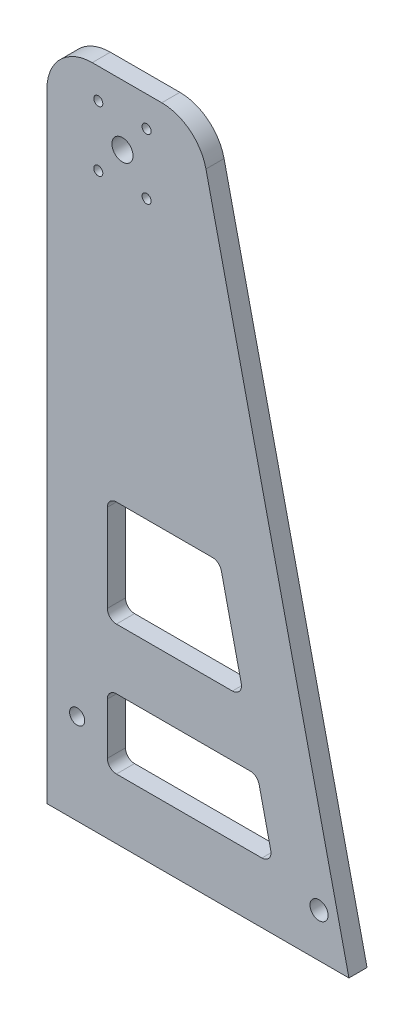
ISO-10303-21;
HEADER;
FILE_DESCRIPTION(('STEP AP214'),'2;1');
FILE_NAME('part.step','',(''),(''),'','','');
FILE_SCHEMA(('AUTOMOTIVE_DESIGN { 1 0 10303 214 1 1 1 1 }'));
ENDSEC;
DATA;
#1=APPLICATION_CONTEXT('core data for automotive mechanical design processes');
#2=APPLICATION_PROTOCOL_DEFINITION('international standard','automotive_design',2000,#1);
#3=PRODUCT_CONTEXT('',#1,'mechanical');
#4=PRODUCT('Part','Part','',(#3));
#5=PRODUCT_RELATED_PRODUCT_CATEGORY('part','',(#4));
#6=PRODUCT_DEFINITION_FORMATION('','',#4);
#7=PRODUCT_DEFINITION_CONTEXT('part definition',#1,'design');
#8=PRODUCT_DEFINITION('design','',#6,#7);
#9=PRODUCT_DEFINITION_SHAPE('','',#8);
#10=(LENGTH_UNIT() NAMED_UNIT(*) SI_UNIT(.MILLI.,.METRE.));
#11=(NAMED_UNIT(*) PLANE_ANGLE_UNIT() SI_UNIT($,.RADIAN.));
#12=(NAMED_UNIT(*) SI_UNIT($,.STERADIAN.) SOLID_ANGLE_UNIT());
#13=UNCERTAINTY_MEASURE_WITH_UNIT(LENGTH_MEASURE(1.E-05),#10,'distance_accuracy_value','');
#14=(GEOMETRIC_REPRESENTATION_CONTEXT(3) GLOBAL_UNCERTAINTY_ASSIGNED_CONTEXT((#13)) GLOBAL_UNIT_ASSIGNED_CONTEXT((#10,
#11,#12)) REPRESENTATION_CONTEXT('',''));
#15=CARTESIAN_POINT('',(0.,0.,0.));
#16=DIRECTION('',(0.,0.,1.));
#17=DIRECTION('',(1.,0.,0.));
#18=AXIS2_PLACEMENT_3D('',#15,#16,#17);
#19=CARTESIAN_POINT('',(0.,0.,6.));
#20=DIRECTION('',(0.,0.,-1.));
#21=DIRECTION('',(-1.,0.,0.));
#22=AXIS2_PLACEMENT_3D('',#19,#20,#21);
#23=PLANE('',#22);
#24=CARTESIAN_POINT('',(90.096252794793,14.5,6.));
#25=DIRECTION('',(0.,0.,-1.));
#26=DIRECTION('',(-1.,0.,0.));
#27=AXIS2_PLACEMENT_3D('',#24,#25,#26);
#28=CIRCLE('',#27,2.99999999999989);
#29=CARTESIAN_POINT('',(87.0962527947931,14.5,6.));
#30=VERTEX_POINT('',#29);
#31=EDGE_CURVE('E225',#30,#30,#28,.T.);
#32=ORIENTED_EDGE('',*,*,#31,.T.);
#33=EDGE_LOOP('',(#32));
#34=FACE_BOUND('',#33,.T.);
#35=CARTESIAN_POINT('',(67.3225612753086,40.,6.));
#36=DIRECTION('',(0.,0.,1.));
#37=DIRECTION('',(1.,0.,0.));
#38=AXIS2_PLACEMENT_3D('',#35,#36,#37);
#39=CIRCLE('',#38,3.);
#40=CARTESIAN_POINT('',(70.247959842683,40.6648633107669,6.));
#41=VERTEX_POINT('',#40);
#42=CARTESIAN_POINT('',(67.3225612753086,43.,6.));
#43=VERTEX_POINT('',#42);
#44=EDGE_CURVE('E256',#41,#43,#39,.T.);
#45=ORIENTED_EDGE('',*,*,#44,.F.);
#46=DIRECTION('',(-0.221621103588969,0.97513285579146,0.));
#47=VECTOR('',#46,1.);
#48=CARTESIAN_POINT('',(74.1115962063194,23.6648633107669,6.));
#49=LINE('',#48,#47);
#50=CARTESIAN_POINT('',(74.1115962063194,23.6648633107669,6.));
#51=VERTEX_POINT('',#50);
#52=EDGE_CURVE('E272',#51,#41,#49,.T.);
#53=ORIENTED_EDGE('',*,*,#52,.F.);
#54=CARTESIAN_POINT('',(71.186197638945,23.,6.));
#55=DIRECTION('',(0.,0.,1.));
#56=DIRECTION('',(1.,0.,0.));
#57=AXIS2_PLACEMENT_3D('',#54,#55,#56);
#58=CIRCLE('',#57,3.);
#59=CARTESIAN_POINT('',(71.186197638945,20.,6.));
#60=VERTEX_POINT('',#59);
#61=EDGE_CURVE('E269',#60,#51,#58,.T.);
#62=ORIENTED_EDGE('',*,*,#61,.F.);
#63=DIRECTION('',(1.,0.,0.));
#64=VECTOR('',#63,1.);
#65=CARTESIAN_POINT('',(23.,20.,6.));
#66=LINE('',#65,#64);
#67=CARTESIAN_POINT('',(23.,20.,6.));
#68=VERTEX_POINT('',#67);
#69=EDGE_CURVE('E267',#68,#60,#66,.T.);
#70=ORIENTED_EDGE('',*,*,#69,.F.);
#71=CARTESIAN_POINT('',(23.,23.,6.));
#72=DIRECTION('',(0.,0.,1.));
#73=DIRECTION('',(1.,0.,0.));
#74=AXIS2_PLACEMENT_3D('',#71,#72,#73);
#75=CIRCLE('',#74,3.);
#76=CARTESIAN_POINT('',(20.,23.,6.));
#77=VERTEX_POINT('',#76);
#78=EDGE_CURVE('E265',#77,#68,#75,.T.);
#79=ORIENTED_EDGE('',*,*,#78,.F.);
#80=DIRECTION('',(0.,-1.,0.));
#81=VECTOR('',#80,1.);
#82=CARTESIAN_POINT('',(20.,40.,6.));
#83=LINE('',#82,#81);
#84=CARTESIAN_POINT('',(20.,40.,6.));
#85=VERTEX_POINT('',#84);
#86=EDGE_CURVE('E263',#85,#77,#83,.T.);
#87=ORIENTED_EDGE('',*,*,#86,.F.);
#88=CARTESIAN_POINT('',(23.,40.,6.));
#89=DIRECTION('',(0.,0.,1.));
#90=DIRECTION('',(-1.,0.,0.));
#91=AXIS2_PLACEMENT_3D('',#88,#89,#90);
#92=CIRCLE('',#91,3.);
#93=CARTESIAN_POINT('',(23.,43.,6.));
#94=VERTEX_POINT('',#93);
#95=EDGE_CURVE('E261',#94,#85,#92,.T.);
#96=ORIENTED_EDGE('',*,*,#95,.F.);
#97=DIRECTION('',(-1.,0.,0.));
#98=VECTOR('',#97,1.);
#99=CARTESIAN_POINT('',(23.,43.,6.));
#100=LINE('',#99,#98);
#101=EDGE_CURVE('E258',#43,#94,#100,.T.);
#102=ORIENTED_EDGE('',*,*,#101,.F.);
#103=EDGE_LOOP('',(#45,#53,#62,#70,#79,#87,#96,#102));
#104=FACE_BOUND('',#103,.T.);
#105=DIRECTION('',(-1.,0.,0.));
#106=VECTOR('',#105,1.);
#107=CARTESIAN_POINT('',(0.,220.,6.));
#108=LINE('',#107,#106);
#109=CARTESIAN_POINT('',(38.0265715827112,220.,6.));
#110=VERTEX_POINT('',#109);
#111=CARTESIAN_POINT('',(15.,220.,6.));
#112=VERTEX_POINT('',#111);
#113=EDGE_CURVE('E357',#110,#112,#108,.T.);
#114=ORIENTED_EDGE('',*,*,#113,.T.);
#115=CARTESIAN_POINT('',(15.,205.,6.));
#116=DIRECTION('',(0.,0.,-1.));
#117=DIRECTION('',(-1.,0.,0.));
#118=AXIS2_PLACEMENT_3D('',#115,#116,#117);
#119=CIRCLE('',#118,15.);
#120=CARTESIAN_POINT('',(0.,205.,6.));
#121=VERTEX_POINT('',#120);
#122=EDGE_CURVE('E41',#112,#121,#119,.F.);
#123=ORIENTED_EDGE('',*,*,#122,.T.);
#124=DIRECTION('',(0.,-1.,0.));
#125=VECTOR('',#124,1.);
#126=CARTESIAN_POINT('',(0.,0.,6.));
#127=LINE('',#126,#125);
#128=CARTESIAN_POINT('',(0.,0.,6.));
#129=VERTEX_POINT('',#128);
#130=EDGE_CURVE('E359',#121,#129,#127,.T.);
#131=ORIENTED_EDGE('',*,*,#130,.T.);
#132=DIRECTION('',(1.,0.,0.));
#133=VECTOR('',#132,1.);
#134=CARTESIAN_POINT('',(100.,0.,6.));
#135=LINE('',#134,#133);
#136=CARTESIAN_POINT('',(100.,0.,6.));
#137=VERTEX_POINT('',#136);
#138=EDGE_CURVE('E351',#129,#137,#135,.T.);
#139=ORIENTED_EDGE('',*,*,#138,.T.);
#140=DIRECTION('',(-0.221621103588968,0.97513285579146,0.));
#141=VECTOR('',#140,1.);
#142=CARTESIAN_POINT('',(50.,220.,6.));
#143=LINE('',#142,#141);
#144=CARTESIAN_POINT('',(52.6535644195831,208.324316553835,6.));
#145=VERTEX_POINT('',#144);
#146=EDGE_CURVE('E354',#137,#145,#143,.T.);
#147=ORIENTED_EDGE('',*,*,#146,.T.);
#148=CARTESIAN_POINT('',(38.0265715827112,205.,6.));
#149=DIRECTION('',(0.,0.,-1.));
#150=DIRECTION('',(-1.,0.,0.));
#151=AXIS2_PLACEMENT_3D('',#148,#149,#150);
#152=CIRCLE('',#151,15.);
#153=EDGE_CURVE('E385',#145,#110,#152,.F.);
#154=ORIENTED_EDGE('',*,*,#153,.T.);
#155=EDGE_LOOP('',(#114,#123,#131,#139,#147,#154));
#156=FACE_BOUND('',#155,.T.);
#157=CARTESIAN_POINT('',(17.,210.,6.));
#158=DIRECTION('',(0.,0.,1.));
#159=DIRECTION('',(1.,0.,0.));
#160=AXIS2_PLACEMENT_3D('',#157,#158,#159);
#161=CIRCLE('',#160,1.5);
#162=CARTESIAN_POINT('',(18.5,210.,6.));
#163=VERTEX_POINT('',#162);
#164=EDGE_CURVE('E345',#163,#163,#161,.T.);
#165=ORIENTED_EDGE('',*,*,#164,.F.);
#166=EDGE_LOOP('',(#165));
#167=FACE_BOUND('',#166,.T.);
#168=CARTESIAN_POINT('',(33.,190.,6.));
#169=DIRECTION('',(0.,0.,1.));
#170=DIRECTION('',(1.,0.,0.));
#171=AXIS2_PLACEMENT_3D('',#168,#169,#170);
#172=CIRCLE('',#171,1.50000000000002);
#173=CARTESIAN_POINT('',(34.5,190.,6.));
#174=VERTEX_POINT('',#173);
#175=EDGE_CURVE('E339',#174,#174,#172,.T.);
#176=ORIENTED_EDGE('',*,*,#175,.F.);
#177=EDGE_LOOP('',(#176));
#178=FACE_BOUND('',#177,.T.);
#179=CARTESIAN_POINT('',(33.,210.,6.));
#180=DIRECTION('',(0.,0.,1.));
#181=DIRECTION('',(-1.,0.,0.));
#182=AXIS2_PLACEMENT_3D('',#179,#180,#181);
#183=CIRCLE('',#182,1.50000000000002);
#184=CARTESIAN_POINT('',(31.5,210.,6.));
#185=VERTEX_POINT('',#184);
#186=EDGE_CURVE('E333',#185,#185,#183,.T.);
#187=ORIENTED_EDGE('',*,*,#186,.F.);
#188=EDGE_LOOP('',(#187));
#189=FACE_BOUND('',#188,.T.);
#190=CARTESIAN_POINT('',(17.,190.,6.));
#191=DIRECTION('',(0.,0.,1.));
#192=DIRECTION('',(-1.,0.,0.));
#193=AXIS2_PLACEMENT_3D('',#190,#191,#192);
#194=CIRCLE('',#193,1.49999999999999);
#195=CARTESIAN_POINT('',(15.5,190.,6.));
#196=VERTEX_POINT('',#195);
#197=EDGE_CURVE('E327',#196,#196,#194,.T.);
#198=ORIENTED_EDGE('',*,*,#197,.F.);
#199=EDGE_LOOP('',(#198));
#200=FACE_BOUND('',#199,.T.);
#201=CARTESIAN_POINT('',(25.,200.,6.));
#202=DIRECTION('',(0.,0.,1.));
#203=DIRECTION('',(1.,0.,0.));
#204=AXIS2_PLACEMENT_3D('',#201,#202,#203);
#205=CIRCLE('',#204,3.5);
#206=CARTESIAN_POINT('',(28.5,200.,6.));
#207=VERTEX_POINT('',#206);
#208=EDGE_CURVE('E321',#207,#207,#205,.T.);
#209=ORIENTED_EDGE('',*,*,#208,.F.);
#210=EDGE_LOOP('',(#209));
#211=FACE_BOUND('',#210,.T.);
#212=CARTESIAN_POINT('',(10.,30.,6.));
#213=DIRECTION('',(0.,0.,1.));
#214=DIRECTION('',(1.,0.,0.));
#215=AXIS2_PLACEMENT_3D('',#212,#213,#214);
#216=CIRCLE('',#215,2.5);
#217=CARTESIAN_POINT('',(12.5,30.,6.));
#218=VERTEX_POINT('',#217);
#219=EDGE_CURVE('E315',#218,#218,#216,.T.);
#220=ORIENTED_EDGE('',*,*,#219,.F.);
#221=EDGE_LOOP('',(#220));
#222=FACE_BOUND('',#221,.T.);
#223=CARTESIAN_POINT('',(54.8225612753087,95.,6.));
#224=DIRECTION('',(0.,0.,1.));
#225=DIRECTION('',(1.,0.,0.));
#226=AXIS2_PLACEMENT_3D('',#223,#224,#225);
#227=CIRCLE('',#226,3.00000000000001);
#228=CARTESIAN_POINT('',(57.747959842683,95.6648633107669,6.));
#229=VERTEX_POINT('',#228);
#230=CARTESIAN_POINT('',(54.8225612753087,98.,6.));
#231=VERTEX_POINT('',#230);
#232=EDGE_CURVE('E184',#229,#231,#227,.T.);
#233=ORIENTED_EDGE('',*,*,#232,.F.);
#234=DIRECTION('',(-0.221621103588968,0.97513285579146,0.));
#235=VECTOR('',#234,1.);
#236=CARTESIAN_POINT('',(64.3388689335921,66.6648633107669,6.));
#237=LINE('',#236,#235);
#238=CARTESIAN_POINT('',(64.3388689335921,66.6648633107669,6.));
#239=VERTEX_POINT('',#238);
#240=EDGE_CURVE('E221',#239,#229,#237,.T.);
#241=ORIENTED_EDGE('',*,*,#240,.F.);
#242=CARTESIAN_POINT('',(61.4134703662177,66.,6.));
#243=DIRECTION('',(0.,0.,1.));
#244=DIRECTION('',(1.,0.,0.));
#245=AXIS2_PLACEMENT_3D('',#242,#243,#244);
#246=CIRCLE('',#245,3.);
#247=CARTESIAN_POINT('',(61.4134703662177,63.,6.));
#248=VERTEX_POINT('',#247);
#249=EDGE_CURVE('E218',#248,#239,#246,.T.);
#250=ORIENTED_EDGE('',*,*,#249,.F.);
#251=DIRECTION('',(1.,0.,0.));
#252=VECTOR('',#251,1.);
#253=CARTESIAN_POINT('',(23.,63.,6.));
#254=LINE('',#253,#252);
#255=CARTESIAN_POINT('',(23.,63.,6.));
#256=VERTEX_POINT('',#255);
#257=EDGE_CURVE('E216',#256,#248,#254,.T.);
#258=ORIENTED_EDGE('',*,*,#257,.F.);
#259=CARTESIAN_POINT('',(23.,66.,6.));
#260=DIRECTION('',(0.,0.,1.));
#261=DIRECTION('',(1.,0.,0.));
#262=AXIS2_PLACEMENT_3D('',#259,#260,#261);
#263=CIRCLE('',#262,3.00000000000001);
#264=CARTESIAN_POINT('',(20.,66.,6.));
#265=VERTEX_POINT('',#264);
#266=EDGE_CURVE('E214',#265,#256,#263,.T.);
#267=ORIENTED_EDGE('',*,*,#266,.F.);
#268=DIRECTION('',(0.,-1.,0.));
#269=VECTOR('',#268,1.);
#270=CARTESIAN_POINT('',(20.,95.,6.));
#271=LINE('',#270,#269);
#272=CARTESIAN_POINT('',(20.,95.,6.));
#273=VERTEX_POINT('',#272);
#274=EDGE_CURVE('E209',#273,#265,#271,.T.);
#275=ORIENTED_EDGE('',*,*,#274,.F.);
#276=CARTESIAN_POINT('',(23.,95.,6.));
#277=DIRECTION('',(0.,0.,1.));
#278=DIRECTION('',(-1.,0.,0.));
#279=AXIS2_PLACEMENT_3D('',#276,#277,#278);
#280=CIRCLE('',#279,3.);
#281=CARTESIAN_POINT('',(23.,98.,6.));
#282=VERTEX_POINT('',#281);
#283=EDGE_CURVE('E207',#282,#273,#280,.T.);
#284=ORIENTED_EDGE('',*,*,#283,.F.);
#285=DIRECTION('',(-1.,0.,0.));
#286=VECTOR('',#285,1.);
#287=CARTESIAN_POINT('',(54.8225612753087,98.,6.));
#288=LINE('',#287,#286);
#289=EDGE_CURVE('E194',#231,#282,#288,.T.);
#290=ORIENTED_EDGE('',*,*,#289,.F.);
#291=EDGE_LOOP('',(#233,#241,#250,#258,#267,#275,#284,#290));
#292=FACE_BOUND('',#291,.T.);
#293=ADVANCED_FACE('F33',(#34,#104,#156,#167,#178,#189,#200,#211,#222,#292),#23,.F.);
#294=CARTESIAN_POINT('',(0.,0.,0.));
#295=DIRECTION('',(0.,0.,-1.));
#296=DIRECTION('',(-1.,0.,0.));
#297=AXIS2_PLACEMENT_3D('',#294,#295,#296);
#298=PLANE('',#297);
#299=CARTESIAN_POINT('',(90.096252794793,14.5,0.));
#300=DIRECTION('',(0.,0.,-1.));
#301=DIRECTION('',(-1.,0.,0.));
#302=AXIS2_PLACEMENT_3D('',#299,#300,#301);
#303=CIRCLE('',#302,2.99999999999989);
#304=CARTESIAN_POINT('',(87.0962527947931,14.5,0.));
#305=VERTEX_POINT('',#304);
#306=EDGE_CURVE('E706',#305,#305,#303,.T.);
#307=ORIENTED_EDGE('',*,*,#306,.F.);
#308=EDGE_LOOP('',(#307));
#309=FACE_BOUND('',#308,.T.);
#310=CARTESIAN_POINT('',(25.,200.,0.));
#311=DIRECTION('',(0.,0.,1.));
#312=DIRECTION('',(1.,0.,0.));
#313=AXIS2_PLACEMENT_3D('',#310,#311,#312);
#314=CIRCLE('',#313,3.5);
#315=CARTESIAN_POINT('',(28.5,200.,0.));
#316=VERTEX_POINT('',#315);
#317=EDGE_CURVE('E318',#316,#316,#314,.T.);
#318=ORIENTED_EDGE('',*,*,#317,.T.);
#319=EDGE_LOOP('',(#318));
#320=FACE_BOUND('',#319,.T.);
#321=CARTESIAN_POINT('',(33.,210.,0.));
#322=DIRECTION('',(0.,0.,1.));
#323=DIRECTION('',(-1.,0.,0.));
#324=AXIS2_PLACEMENT_3D('',#321,#322,#323);
#325=CIRCLE('',#324,1.50000000000002);
#326=CARTESIAN_POINT('',(31.5,210.,0.));
#327=VERTEX_POINT('',#326);
#328=EDGE_CURVE('E330',#327,#327,#325,.T.);
#329=ORIENTED_EDGE('',*,*,#328,.T.);
#330=EDGE_LOOP('',(#329));
#331=FACE_BOUND('',#330,.T.);
#332=CARTESIAN_POINT('',(17.,210.,0.));
#333=DIRECTION('',(0.,0.,1.));
#334=DIRECTION('',(1.,0.,0.));
#335=AXIS2_PLACEMENT_3D('',#332,#333,#334);
#336=CIRCLE('',#335,1.5);
#337=CARTESIAN_POINT('',(18.5,210.,0.));
#338=VERTEX_POINT('',#337);
#339=EDGE_CURVE('E342',#338,#338,#336,.T.);
#340=ORIENTED_EDGE('',*,*,#339,.T.);
#341=EDGE_LOOP('',(#340));
#342=FACE_BOUND('',#341,.T.);
#343=DIRECTION('',(0.,-1.,0.));
#344=VECTOR('',#343,1.);
#345=CARTESIAN_POINT('',(0.,0.,0.));
#346=LINE('',#345,#344);
#347=CARTESIAN_POINT('',(0.,205.,0.));
#348=VERTEX_POINT('',#347);
#349=CARTESIAN_POINT('',(0.,0.,0.));
#350=VERTEX_POINT('',#349);
#351=EDGE_CURVE('E355',#348,#350,#346,.T.);
#352=ORIENTED_EDGE('',*,*,#351,.F.);
#353=CARTESIAN_POINT('',(15.,205.,0.));
#354=DIRECTION('',(0.,0.,-1.));
#355=DIRECTION('',(-1.,0.,0.));
#356=AXIS2_PLACEMENT_3D('',#353,#354,#355);
#357=CIRCLE('',#356,15.);
#358=CARTESIAN_POINT('',(15.,220.,0.));
#359=VERTEX_POINT('',#358);
#360=EDGE_CURVE('E379',#348,#359,#357,.T.);
#361=ORIENTED_EDGE('',*,*,#360,.T.);
#362=DIRECTION('',(-1.,0.,0.));
#363=VECTOR('',#362,1.);
#364=CARTESIAN_POINT('',(0.,220.,0.));
#365=LINE('',#364,#363);
#366=CARTESIAN_POINT('',(38.0265715827112,220.,0.));
#367=VERTEX_POINT('',#366);
#368=EDGE_CURVE('E366',#367,#359,#365,.T.);
#369=ORIENTED_EDGE('',*,*,#368,.F.);
#370=CARTESIAN_POINT('',(38.0265715827112,205.,0.));
#371=DIRECTION('',(0.,0.,-1.));
#372=DIRECTION('',(-1.,0.,0.));
#373=AXIS2_PLACEMENT_3D('',#370,#371,#372);
#374=CIRCLE('',#373,15.);
#375=CARTESIAN_POINT('',(52.6535644195831,208.324316553835,0.));
#376=VERTEX_POINT('',#375);
#377=EDGE_CURVE('E377',#367,#376,#374,.T.);
#378=ORIENTED_EDGE('',*,*,#377,.T.);
#379=DIRECTION('',(-0.221621103588968,0.97513285579146,0.));
#380=VECTOR('',#379,1.);
#381=CARTESIAN_POINT('',(50.,220.,0.));
#382=LINE('',#381,#380);
#383=CARTESIAN_POINT('',(100.,0.,0.));
#384=VERTEX_POINT('',#383);
#385=EDGE_CURVE('E364',#384,#376,#382,.T.);
#386=ORIENTED_EDGE('',*,*,#385,.F.);
#387=DIRECTION('',(1.,0.,0.));
#388=VECTOR('',#387,1.);
#389=CARTESIAN_POINT('',(100.,0.,0.));
#390=LINE('',#389,#388);
#391=EDGE_CURVE('E348',#350,#384,#390,.T.);
#392=ORIENTED_EDGE('',*,*,#391,.F.);
#393=EDGE_LOOP('',(#352,#361,#369,#378,#386,#392));
#394=FACE_BOUND('',#393,.T.);
#395=CARTESIAN_POINT('',(33.,190.,0.));
#396=DIRECTION('',(0.,0.,1.));
#397=DIRECTION('',(1.,0.,0.));
#398=AXIS2_PLACEMENT_3D('',#395,#396,#397);
#399=CIRCLE('',#398,1.50000000000002);
#400=CARTESIAN_POINT('',(34.5,190.,0.));
#401=VERTEX_POINT('',#400);
#402=EDGE_CURVE('E336',#401,#401,#399,.T.);
#403=ORIENTED_EDGE('',*,*,#402,.T.);
#404=EDGE_LOOP('',(#403));
#405=FACE_BOUND('',#404,.T.);
#406=CARTESIAN_POINT('',(17.,190.,0.));
#407=DIRECTION('',(0.,0.,1.));
#408=DIRECTION('',(-1.,0.,0.));
#409=AXIS2_PLACEMENT_3D('',#406,#407,#408);
#410=CIRCLE('',#409,1.49999999999999);
#411=CARTESIAN_POINT('',(15.5,190.,0.));
#412=VERTEX_POINT('',#411);
#413=EDGE_CURVE('E324',#412,#412,#410,.T.);
#414=ORIENTED_EDGE('',*,*,#413,.T.);
#415=EDGE_LOOP('',(#414));
#416=FACE_BOUND('',#415,.T.);
#417=CARTESIAN_POINT('',(10.,30.,0.));
#418=DIRECTION('',(0.,0.,1.));
#419=DIRECTION('',(1.,0.,0.));
#420=AXIS2_PLACEMENT_3D('',#417,#418,#419);
#421=CIRCLE('',#420,2.5);
#422=CARTESIAN_POINT('',(12.5,30.,0.));
#423=VERTEX_POINT('',#422);
#424=EDGE_CURVE('E314',#423,#423,#421,.T.);
#425=ORIENTED_EDGE('',*,*,#424,.T.);
#426=EDGE_LOOP('',(#425));
#427=FACE_BOUND('',#426,.T.);
#428=DIRECTION('',(-0.221621103588969,0.97513285579146,0.));
#429=VECTOR('',#428,1.);
#430=CARTESIAN_POINT('',(74.1115962063194,23.6648633107669,0.));
#431=LINE('',#430,#429);
#432=CARTESIAN_POINT('',(74.1115962063194,23.6648633107669,0.));
#433=VERTEX_POINT('',#432);
#434=CARTESIAN_POINT('',(70.247959842683,40.6648633107669,0.));
#435=VERTEX_POINT('',#434);
#436=EDGE_CURVE('E259',#433,#435,#431,.T.);
#437=ORIENTED_EDGE('',*,*,#436,.T.);
#438=CARTESIAN_POINT('',(67.3225612753086,40.,0.));
#439=DIRECTION('',(0.,0.,1.));
#440=DIRECTION('',(1.,0.,0.));
#441=AXIS2_PLACEMENT_3D('',#438,#439,#440);
#442=CIRCLE('',#441,3.);
#443=CARTESIAN_POINT('',(67.3225612753086,43.,0.));
#444=VERTEX_POINT('',#443);
#445=EDGE_CURVE('E202',#435,#444,#442,.T.);
#446=ORIENTED_EDGE('',*,*,#445,.T.);
#447=DIRECTION('',(-1.,0.,0.));
#448=VECTOR('',#447,1.);
#449=CARTESIAN_POINT('',(23.,43.,0.));
#450=LINE('',#449,#448);
#451=CARTESIAN_POINT('',(23.,43.,0.));
#452=VERTEX_POINT('',#451);
#453=EDGE_CURVE('E277',#444,#452,#450,.T.);
#454=ORIENTED_EDGE('',*,*,#453,.T.);
#455=CARTESIAN_POINT('',(23.,40.,0.));
#456=DIRECTION('',(0.,0.,1.));
#457=DIRECTION('',(-1.,0.,0.));
#458=AXIS2_PLACEMENT_3D('',#455,#456,#457);
#459=CIRCLE('',#458,3.);
#460=CARTESIAN_POINT('',(20.,40.,0.));
#461=VERTEX_POINT('',#460);
#462=EDGE_CURVE('E280',#452,#461,#459,.T.);
#463=ORIENTED_EDGE('',*,*,#462,.T.);
#464=DIRECTION('',(0.,-1.,0.));
#465=VECTOR('',#464,1.);
#466=CARTESIAN_POINT('',(20.,40.,0.));
#467=LINE('',#466,#465);
#468=CARTESIAN_POINT('',(20.,23.,0.));
#469=VERTEX_POINT('',#468);
#470=EDGE_CURVE('E283',#461,#469,#467,.T.);
#471=ORIENTED_EDGE('',*,*,#470,.T.);
#472=CARTESIAN_POINT('',(23.,23.,0.));
#473=DIRECTION('',(0.,0.,1.));
#474=DIRECTION('',(1.,0.,0.));
#475=AXIS2_PLACEMENT_3D('',#472,#473,#474);
#476=CIRCLE('',#475,3.);
#477=CARTESIAN_POINT('',(23.,20.,0.));
#478=VERTEX_POINT('',#477);
#479=EDGE_CURVE('E286',#469,#478,#476,.T.);
#480=ORIENTED_EDGE('',*,*,#479,.T.);
#481=DIRECTION('',(1.,0.,0.));
#482=VECTOR('',#481,1.);
#483=CARTESIAN_POINT('',(23.,20.,0.));
#484=LINE('',#483,#482);
#485=CARTESIAN_POINT('',(71.186197638945,20.,0.));
#486=VERTEX_POINT('',#485);
#487=EDGE_CURVE('E289',#478,#486,#484,.T.);
#488=ORIENTED_EDGE('',*,*,#487,.T.);
#489=CARTESIAN_POINT('',(71.186197638945,23.,0.));
#490=DIRECTION('',(0.,0.,1.));
#491=DIRECTION('',(1.,0.,0.));
#492=AXIS2_PLACEMENT_3D('',#489,#490,#491);
#493=CIRCLE('',#492,3.);
#494=EDGE_CURVE('E292',#486,#433,#493,.T.);
#495=ORIENTED_EDGE('',*,*,#494,.T.);
#496=EDGE_LOOP('',(#437,#446,#454,#463,#471,#480,#488,#495));
#497=FACE_BOUND('',#496,.T.);
#498=DIRECTION('',(-0.221621103588968,0.97513285579146,0.));
#499=VECTOR('',#498,1.);
#500=CARTESIAN_POINT('',(64.3388689335921,66.6648633107669,0.));
#501=LINE('',#500,#499);
#502=CARTESIAN_POINT('',(64.3388689335921,66.6648633107669,0.));
#503=VERTEX_POINT('',#502);
#504=CARTESIAN_POINT('',(57.747959842683,95.6648633107669,0.));
#505=VERTEX_POINT('',#504);
#506=EDGE_CURVE('E195',#503,#505,#501,.T.);
#507=ORIENTED_EDGE('',*,*,#506,.T.);
#508=CARTESIAN_POINT('',(54.8225612753087,95.,0.));
#509=DIRECTION('',(0.,0.,1.));
#510=DIRECTION('',(1.,0.,0.));
#511=AXIS2_PLACEMENT_3D('',#508,#509,#510);
#512=CIRCLE('',#511,3.00000000000001);
#513=CARTESIAN_POINT('',(54.8225612753087,98.,0.));
#514=VERTEX_POINT('',#513);
#515=EDGE_CURVE('E223',#505,#514,#512,.T.);
#516=ORIENTED_EDGE('',*,*,#515,.T.);
#517=DIRECTION('',(-1.,0.,0.));
#518=VECTOR('',#517,1.);
#519=CARTESIAN_POINT('',(54.8225612753087,98.,0.));
#520=LINE('',#519,#518);
#521=CARTESIAN_POINT('',(23.,98.,0.));
#522=VERTEX_POINT('',#521);
#523=EDGE_CURVE('E201',#514,#522,#520,.T.);
#524=ORIENTED_EDGE('',*,*,#523,.T.);
#525=CARTESIAN_POINT('',(23.,95.,0.));
#526=DIRECTION('',(0.,0.,1.));
#527=DIRECTION('',(-1.,0.,0.));
#528=AXIS2_PLACEMENT_3D('',#525,#526,#527);
#529=CIRCLE('',#528,3.);
#530=CARTESIAN_POINT('',(20.,95.,0.));
#531=VERTEX_POINT('',#530);
#532=EDGE_CURVE('E227',#522,#531,#529,.T.);
#533=ORIENTED_EDGE('',*,*,#532,.T.);
#534=DIRECTION('',(0.,-1.,0.));
#535=VECTOR('',#534,1.);
#536=CARTESIAN_POINT('',(20.,95.,0.));
#537=LINE('',#536,#535);
#538=CARTESIAN_POINT('',(20.,66.,0.));
#539=VERTEX_POINT('',#538);
#540=EDGE_CURVE('E230',#531,#539,#537,.T.);
#541=ORIENTED_EDGE('',*,*,#540,.T.);
#542=CARTESIAN_POINT('',(23.,66.,0.));
#543=DIRECTION('',(0.,0.,1.));
#544=DIRECTION('',(1.,0.,0.));
#545=AXIS2_PLACEMENT_3D('',#542,#543,#544);
#546=CIRCLE('',#545,3.00000000000001);
#547=CARTESIAN_POINT('',(23.,63.,0.));
#548=VERTEX_POINT('',#547);
#549=EDGE_CURVE('E233',#539,#548,#546,.T.);
#550=ORIENTED_EDGE('',*,*,#549,.T.);
#551=DIRECTION('',(1.,0.,0.));
#552=VECTOR('',#551,1.);
#553=CARTESIAN_POINT('',(23.,63.,0.));
#554=LINE('',#553,#552);
#555=CARTESIAN_POINT('',(61.4134703662177,63.,0.));
#556=VERTEX_POINT('',#555);
#557=EDGE_CURVE('E236',#548,#556,#554,.T.);
#558=ORIENTED_EDGE('',*,*,#557,.T.);
#559=CARTESIAN_POINT('',(61.4134703662177,66.,0.));
#560=DIRECTION('',(0.,0.,1.));
#561=DIRECTION('',(1.,0.,0.));
#562=AXIS2_PLACEMENT_3D('',#559,#560,#561);
#563=CIRCLE('',#562,3.);
#564=EDGE_CURVE('E239',#556,#503,#563,.T.);
#565=ORIENTED_EDGE('',*,*,#564,.T.);
#566=EDGE_LOOP('',(#507,#516,#524,#533,#541,#550,#558,#565));
#567=FACE_BOUND('',#566,.T.);
#568=ADVANCED_FACE('F400',(#309,#320,#331,#342,#394,#405,#416,#427,#497,#567),#298,.T.);
#569=CARTESIAN_POINT('',(100.,0.,6.));
#570=DIRECTION('',(0.,1.,0.));
#571=DIRECTION('',(-1.,0.,0.));
#572=AXIS2_PLACEMENT_3D('',#569,#570,#571);
#573=PLANE('',#572);
#574=ORIENTED_EDGE('',*,*,#391,.T.);
#575=DIRECTION('',(0.,0.,-1.));
#576=VECTOR('',#575,1.);
#577=CARTESIAN_POINT('',(100.,0.,6.));
#578=LINE('',#577,#576);
#579=EDGE_CURVE('E371',#137,#384,#578,.T.);
#580=ORIENTED_EDGE('',*,*,#579,.F.);
#581=ORIENTED_EDGE('',*,*,#138,.F.);
#582=DIRECTION('',(0.,0.,-1.));
#583=VECTOR('',#582,1.);
#584=CARTESIAN_POINT('',(0.,0.,6.));
#585=LINE('',#584,#583);
#586=EDGE_CURVE('E361',#129,#350,#585,.T.);
#587=ORIENTED_EDGE('',*,*,#586,.T.);
#588=EDGE_LOOP('',(#574,#580,#581,#587));
#589=FACE_BOUND('',#588,.T.);
#590=ADVANCED_FACE('F410',(#589),#573,.F.);
#591=CARTESIAN_POINT('',(50.,220.,6.));
#592=DIRECTION('',(-0.97513285579146,-0.221621103588968,0.));
#593=DIRECTION('',(0.221621103588968,-0.97513285579146,0.));
#594=AXIS2_PLACEMENT_3D('',#591,#592,#593);
#595=PLANE('',#594);
#596=ORIENTED_EDGE('',*,*,#385,.T.);
#597=DIRECTION('',(0.,0.,-1.));
#598=VECTOR('',#597,1.);
#599=CARTESIAN_POINT('',(52.6535644195831,208.324316553835,6.));
#600=LINE('',#599,#598);
#601=EDGE_CURVE('E11',#376,#145,#600,.F.);
#602=ORIENTED_EDGE('',*,*,#601,.T.);
#603=ORIENTED_EDGE('',*,*,#146,.F.);
#604=ORIENTED_EDGE('',*,*,#579,.T.);
#605=EDGE_LOOP('',(#596,#602,#603,#604));
#606=FACE_BOUND('',#605,.T.);
#607=ADVANCED_FACE('F407',(#606),#595,.F.);
#608=CARTESIAN_POINT('',(0.,220.,6.));
#609=DIRECTION('',(0.,-1.,0.));
#610=DIRECTION('',(0.,0.,-1.));
#611=AXIS2_PLACEMENT_3D('',#608,#609,#610);
#612=PLANE('',#611);
#613=ORIENTED_EDGE('',*,*,#368,.T.);
#614=DIRECTION('',(0.,0.,-1.));
#615=VECTOR('',#614,1.);
#616=CARTESIAN_POINT('',(15.,220.,6.));
#617=LINE('',#616,#615);
#618=EDGE_CURVE('E54',#359,#112,#617,.F.);
#619=ORIENTED_EDGE('',*,*,#618,.T.);
#620=ORIENTED_EDGE('',*,*,#113,.F.);
#621=DIRECTION('',(0.,0.,-1.));
#622=VECTOR('',#621,1.);
#623=CARTESIAN_POINT('',(38.0265715827112,220.,6.));
#624=LINE('',#623,#622);
#625=EDGE_CURVE('E381',#110,#367,#624,.T.);
#626=ORIENTED_EDGE('',*,*,#625,.T.);
#627=EDGE_LOOP('',(#613,#619,#620,#626));
#628=FACE_BOUND('',#627,.T.);
#629=ADVANCED_FACE('F403',(#628),#612,.F.);
#630=CARTESIAN_POINT('',(0.,0.,6.));
#631=DIRECTION('',(1.,0.,0.));
#632=DIRECTION('',(0.,0.,-1.));
#633=AXIS2_PLACEMENT_3D('',#630,#631,#632);
#634=PLANE('',#633);
#635=ORIENTED_EDGE('',*,*,#130,.F.);
#636=DIRECTION('',(0.,0.,-1.));
#637=VECTOR('',#636,1.);
#638=CARTESIAN_POINT('',(0.,205.,6.));
#639=LINE('',#638,#637);
#640=EDGE_CURVE('E374',#121,#348,#639,.T.);
#641=ORIENTED_EDGE('',*,*,#640,.T.);
#642=ORIENTED_EDGE('',*,*,#351,.T.);
#643=ORIENTED_EDGE('',*,*,#586,.F.);
#644=EDGE_LOOP('',(#635,#641,#642,#643));
#645=FACE_BOUND('',#644,.T.);
#646=ADVANCED_FACE('F394',(#645),#634,.F.);
#647=CARTESIAN_POINT('',(17.,210.,6.));
#648=DIRECTION('',(0.,0.,-1.));
#649=DIRECTION('',(-1.,0.,0.));
#650=AXIS2_PLACEMENT_3D('',#647,#648,#649);
#651=CYLINDRICAL_SURFACE('',#650,1.5);
#652=ORIENTED_EDGE('',*,*,#164,.T.);
#653=EDGE_LOOP('',(#652));
#654=FACE_BOUND('',#653,.T.);
#655=ORIENTED_EDGE('',*,*,#339,.F.);
#656=EDGE_LOOP('',(#655));
#657=FACE_BOUND('',#656,.T.);
#658=ADVANCED_FACE('F428',(#654,#657),#651,.F.);
#659=CARTESIAN_POINT('',(33.,190.,6.));
#660=DIRECTION('',(0.,0.,-1.));
#661=DIRECTION('',(-1.,0.,0.));
#662=AXIS2_PLACEMENT_3D('',#659,#660,#661);
#663=CYLINDRICAL_SURFACE('',#662,1.50000000000002);
#664=ORIENTED_EDGE('',*,*,#175,.T.);
#665=EDGE_LOOP('',(#664));
#666=FACE_BOUND('',#665,.T.);
#667=ORIENTED_EDGE('',*,*,#402,.F.);
#668=EDGE_LOOP('',(#667));
#669=FACE_BOUND('',#668,.T.);
#670=ADVANCED_FACE('F449',(#666,#669),#663,.F.);
#671=CARTESIAN_POINT('',(33.,210.,6.));
#672=DIRECTION('',(0.,0.,-1.));
#673=DIRECTION('',(-1.,0.,0.));
#674=AXIS2_PLACEMENT_3D('',#671,#672,#673);
#675=CYLINDRICAL_SURFACE('',#674,1.50000000000002);
#676=ORIENTED_EDGE('',*,*,#186,.T.);
#677=EDGE_LOOP('',(#676));
#678=FACE_BOUND('',#677,.T.);
#679=ORIENTED_EDGE('',*,*,#328,.F.);
#680=EDGE_LOOP('',(#679));
#681=FACE_BOUND('',#680,.T.);
#682=ADVANCED_FACE('F456',(#678,#681),#675,.F.);
#683=CARTESIAN_POINT('',(17.,190.,6.));
#684=DIRECTION('',(0.,0.,-1.));
#685=DIRECTION('',(-1.,0.,0.));
#686=AXIS2_PLACEMENT_3D('',#683,#684,#685);
#687=CYLINDRICAL_SURFACE('',#686,1.49999999999999);
#688=ORIENTED_EDGE('',*,*,#197,.T.);
#689=EDGE_LOOP('',(#688));
#690=FACE_BOUND('',#689,.T.);
#691=ORIENTED_EDGE('',*,*,#413,.F.);
#692=EDGE_LOOP('',(#691));
#693=FACE_BOUND('',#692,.T.);
#694=ADVANCED_FACE('F463',(#690,#693),#687,.F.);
#695=CARTESIAN_POINT('',(25.,200.,6.));
#696=DIRECTION('',(0.,0.,-1.));
#697=DIRECTION('',(-1.,0.,0.));
#698=AXIS2_PLACEMENT_3D('',#695,#696,#697);
#699=CYLINDRICAL_SURFACE('',#698,3.5);
#700=ORIENTED_EDGE('',*,*,#208,.T.);
#701=EDGE_LOOP('',(#700));
#702=FACE_BOUND('',#701,.T.);
#703=ORIENTED_EDGE('',*,*,#317,.F.);
#704=EDGE_LOOP('',(#703));
#705=FACE_BOUND('',#704,.T.);
#706=ADVANCED_FACE('F471',(#702,#705),#699,.F.);
#707=CARTESIAN_POINT('',(10.,30.,6.));
#708=DIRECTION('',(0.,0.,-1.));
#709=DIRECTION('',(-1.,0.,0.));
#710=AXIS2_PLACEMENT_3D('',#707,#708,#709);
#711=CYLINDRICAL_SURFACE('',#710,2.5);
#712=ORIENTED_EDGE('',*,*,#219,.T.);
#713=EDGE_LOOP('',(#712));
#714=FACE_BOUND('',#713,.T.);
#715=ORIENTED_EDGE('',*,*,#424,.F.);
#716=EDGE_LOOP('',(#715));
#717=FACE_BOUND('',#716,.T.);
#718=ADVANCED_FACE('F479',(#714,#717),#711,.F.);
#719=CARTESIAN_POINT('',(67.3225612753086,40.,6.));
#720=DIRECTION('',(0.,0.,-1.));
#721=DIRECTION('',(-1.,0.,0.));
#722=AXIS2_PLACEMENT_3D('',#719,#720,#721);
#723=CYLINDRICAL_SURFACE('',#722,3.);
#724=ORIENTED_EDGE('',*,*,#445,.F.);
#725=DIRECTION('',(0.,0.,-1.));
#726=VECTOR('',#725,1.);
#727=CARTESIAN_POINT('',(70.247959842683,40.6648633107669,6.));
#728=LINE('',#727,#726);
#729=EDGE_CURVE('E274',#41,#435,#728,.T.);
#730=ORIENTED_EDGE('',*,*,#729,.F.);
#731=ORIENTED_EDGE('',*,*,#44,.T.);
#732=DIRECTION('',(0.,0.,-1.));
#733=VECTOR('',#732,1.);
#734=CARTESIAN_POINT('',(67.3225612753086,43.,6.));
#735=LINE('',#734,#733);
#736=EDGE_CURVE('E311',#43,#444,#735,.T.);
#737=ORIENTED_EDGE('',*,*,#736,.T.);
#738=EDGE_LOOP('',(#724,#730,#731,#737));
#739=FACE_BOUND('',#738,.T.);
#740=ADVANCED_FACE('F487',(#739),#723,.F.);
#741=CARTESIAN_POINT('',(23.,43.,6.));
#742=DIRECTION('',(0.,-1.,0.));
#743=DIRECTION('',(1.,0.,0.));
#744=AXIS2_PLACEMENT_3D('',#741,#742,#743);
#745=PLANE('',#744);
#746=ORIENTED_EDGE('',*,*,#453,.F.);
#747=ORIENTED_EDGE('',*,*,#736,.F.);
#748=ORIENTED_EDGE('',*,*,#101,.T.);
#749=DIRECTION('',(0.,0.,-1.));
#750=VECTOR('',#749,1.);
#751=CARTESIAN_POINT('',(23.,43.,6.));
#752=LINE('',#751,#750);
#753=EDGE_CURVE('E309',#94,#452,#752,.T.);
#754=ORIENTED_EDGE('',*,*,#753,.T.);
#755=EDGE_LOOP('',(#746,#747,#748,#754));
#756=FACE_BOUND('',#755,.T.);
#757=ADVANCED_FACE('F495',(#756),#745,.T.);
#758=CARTESIAN_POINT('',(23.,40.,6.));
#759=DIRECTION('',(0.,0.,-1.));
#760=DIRECTION('',(-1.,0.,0.));
#761=AXIS2_PLACEMENT_3D('',#758,#759,#760);
#762=CYLINDRICAL_SURFACE('',#761,3.);
#763=ORIENTED_EDGE('',*,*,#462,.F.);
#764=ORIENTED_EDGE('',*,*,#753,.F.);
#765=ORIENTED_EDGE('',*,*,#95,.T.);
#766=DIRECTION('',(0.,0.,-1.));
#767=VECTOR('',#766,1.);
#768=CARTESIAN_POINT('',(20.,40.,6.));
#769=LINE('',#768,#767);
#770=EDGE_CURVE('E307',#85,#461,#769,.T.);
#771=ORIENTED_EDGE('',*,*,#770,.T.);
#772=EDGE_LOOP('',(#763,#764,#765,#771));
#773=FACE_BOUND('',#772,.T.);
#774=ADVANCED_FACE('F503',(#773),#762,.F.);
#775=CARTESIAN_POINT('',(20.,40.,6.));
#776=DIRECTION('',(1.,0.,0.));
#777=DIRECTION('',(0.,1.,0.));
#778=AXIS2_PLACEMENT_3D('',#775,#776,#777);
#779=PLANE('',#778);
#780=ORIENTED_EDGE('',*,*,#470,.F.);
#781=ORIENTED_EDGE('',*,*,#770,.F.);
#782=ORIENTED_EDGE('',*,*,#86,.T.);
#783=DIRECTION('',(0.,0.,-1.));
#784=VECTOR('',#783,1.);
#785=CARTESIAN_POINT('',(20.,23.,6.));
#786=LINE('',#785,#784);
#787=EDGE_CURVE('E305',#77,#469,#786,.T.);
#788=ORIENTED_EDGE('',*,*,#787,.T.);
#789=EDGE_LOOP('',(#780,#781,#782,#788));
#790=FACE_BOUND('',#789,.T.);
#791=ADVANCED_FACE('F511',(#790),#779,.T.);
#792=CARTESIAN_POINT('',(23.,23.,6.));
#793=DIRECTION('',(0.,0.,-1.));
#794=DIRECTION('',(-1.,0.,0.));
#795=AXIS2_PLACEMENT_3D('',#792,#793,#794);
#796=CYLINDRICAL_SURFACE('',#795,3.);
#797=ORIENTED_EDGE('',*,*,#479,.F.);
#798=ORIENTED_EDGE('',*,*,#787,.F.);
#799=ORIENTED_EDGE('',*,*,#78,.T.);
#800=DIRECTION('',(0.,0.,-1.));
#801=VECTOR('',#800,1.);
#802=CARTESIAN_POINT('',(23.,20.,6.));
#803=LINE('',#802,#801);
#804=EDGE_CURVE('E303',#68,#478,#803,.T.);
#805=ORIENTED_EDGE('',*,*,#804,.T.);
#806=EDGE_LOOP('',(#797,#798,#799,#805));
#807=FACE_BOUND('',#806,.T.);
#808=ADVANCED_FACE('F519',(#807),#796,.F.);
#809=CARTESIAN_POINT('',(23.,20.,6.));
#810=DIRECTION('',(0.,1.,0.));
#811=DIRECTION('',(-1.,0.,0.));
#812=AXIS2_PLACEMENT_3D('',#809,#810,#811);
#813=PLANE('',#812);
#814=ORIENTED_EDGE('',*,*,#487,.F.);
#815=ORIENTED_EDGE('',*,*,#804,.F.);
#816=ORIENTED_EDGE('',*,*,#69,.T.);
#817=DIRECTION('',(0.,0.,-1.));
#818=VECTOR('',#817,1.);
#819=CARTESIAN_POINT('',(71.186197638945,20.,6.));
#820=LINE('',#819,#818);
#821=EDGE_CURVE('E301',#60,#486,#820,.T.);
#822=ORIENTED_EDGE('',*,*,#821,.T.);
#823=EDGE_LOOP('',(#814,#815,#816,#822));
#824=FACE_BOUND('',#823,.T.);
#825=ADVANCED_FACE('F527',(#824),#813,.T.);
#826=CARTESIAN_POINT('',(71.186197638945,23.,6.));
#827=DIRECTION('',(0.,0.,-1.));
#828=DIRECTION('',(-1.,0.,0.));
#829=AXIS2_PLACEMENT_3D('',#826,#827,#828);
#830=CYLINDRICAL_SURFACE('',#829,3.);
#831=ORIENTED_EDGE('',*,*,#494,.F.);
#832=ORIENTED_EDGE('',*,*,#821,.F.);
#833=ORIENTED_EDGE('',*,*,#61,.T.);
#834=DIRECTION('',(0.,0.,-1.));
#835=VECTOR('',#834,1.);
#836=CARTESIAN_POINT('',(74.1115962063194,23.6648633107669,6.));
#837=LINE('',#836,#835);
#838=EDGE_CURVE('E299',#51,#433,#837,.T.);
#839=ORIENTED_EDGE('',*,*,#838,.T.);
#840=EDGE_LOOP('',(#831,#832,#833,#839));
#841=FACE_BOUND('',#840,.T.);
#842=ADVANCED_FACE('F535',(#841),#830,.F.);
#843=CARTESIAN_POINT('',(74.1115962063194,23.6648633107669,6.));
#844=DIRECTION('',(-0.97513285579146,-0.221621103588969,0.));
#845=DIRECTION('',(0.221621103588969,-0.97513285579146,0.));
#846=AXIS2_PLACEMENT_3D('',#843,#844,#845);
#847=PLANE('',#846);
#848=ORIENTED_EDGE('',*,*,#436,.F.);
#849=ORIENTED_EDGE('',*,*,#838,.F.);
#850=ORIENTED_EDGE('',*,*,#52,.T.);
#851=ORIENTED_EDGE('',*,*,#729,.T.);
#852=EDGE_LOOP('',(#848,#849,#850,#851));
#853=FACE_BOUND('',#852,.T.);
#854=ADVANCED_FACE('F543',(#853),#847,.T.);
#855=CARTESIAN_POINT('',(54.8225612753087,95.,6.));
#856=DIRECTION('',(0.,0.,-1.));
#857=DIRECTION('',(-1.,0.,0.));
#858=AXIS2_PLACEMENT_3D('',#855,#856,#857);
#859=CYLINDRICAL_SURFACE('',#858,3.00000000000001);
#860=ORIENTED_EDGE('',*,*,#515,.F.);
#861=DIRECTION('',(0.,0.,-1.));
#862=VECTOR('',#861,1.);
#863=CARTESIAN_POINT('',(57.747959842683,95.6648633107669,6.));
#864=LINE('',#863,#862);
#865=EDGE_CURVE('E190',#229,#505,#864,.T.);
#866=ORIENTED_EDGE('',*,*,#865,.F.);
#867=ORIENTED_EDGE('',*,*,#232,.T.);
#868=DIRECTION('',(0.,0.,-1.));
#869=VECTOR('',#868,1.);
#870=CARTESIAN_POINT('',(54.8225612753087,98.,6.));
#871=LINE('',#870,#869);
#872=EDGE_CURVE('E187',#231,#514,#871,.T.);
#873=ORIENTED_EDGE('',*,*,#872,.T.);
#874=EDGE_LOOP('',(#860,#866,#867,#873));
#875=FACE_BOUND('',#874,.T.);
#876=ADVANCED_FACE('F186',(#875),#859,.F.);
#877=CARTESIAN_POINT('',(54.8225612753087,98.,6.));
#878=DIRECTION('',(0.,-1.,0.));
#879=DIRECTION('',(1.,0.,0.));
#880=AXIS2_PLACEMENT_3D('',#877,#878,#879);
#881=PLANE('',#880);
#882=ORIENTED_EDGE('',*,*,#523,.F.);
#883=ORIENTED_EDGE('',*,*,#872,.F.);
#884=ORIENTED_EDGE('',*,*,#289,.T.);
#885=DIRECTION('',(0.,0.,-1.));
#886=VECTOR('',#885,1.);
#887=CARTESIAN_POINT('',(23.,98.,6.));
#888=LINE('',#887,#886);
#889=EDGE_CURVE('E203',#282,#522,#888,.T.);
#890=ORIENTED_EDGE('',*,*,#889,.T.);
#891=EDGE_LOOP('',(#882,#883,#884,#890));
#892=FACE_BOUND('',#891,.T.);
#893=ADVANCED_FACE('F198',(#892),#881,.T.);
#894=CARTESIAN_POINT('',(23.,95.,6.));
#895=DIRECTION('',(0.,0.,-1.));
#896=DIRECTION('',(-1.,0.,0.));
#897=AXIS2_PLACEMENT_3D('',#894,#895,#896);
#898=CYLINDRICAL_SURFACE('',#897,3.);
#899=ORIENTED_EDGE('',*,*,#532,.F.);
#900=ORIENTED_EDGE('',*,*,#889,.F.);
#901=ORIENTED_EDGE('',*,*,#283,.T.);
#902=DIRECTION('',(0.,0.,-1.));
#903=VECTOR('',#902,1.);
#904=CARTESIAN_POINT('',(20.,95.,6.));
#905=LINE('',#904,#903);
#906=EDGE_CURVE('E253',#273,#531,#905,.T.);
#907=ORIENTED_EDGE('',*,*,#906,.T.);
#908=EDGE_LOOP('',(#899,#900,#901,#907));
#909=FACE_BOUND('',#908,.T.);
#910=ADVANCED_FACE('F564',(#909),#898,.F.);
#911=CARTESIAN_POINT('',(20.,95.,6.));
#912=DIRECTION('',(1.,0.,0.));
#913=DIRECTION('',(0.,1.,0.));
#914=AXIS2_PLACEMENT_3D('',#911,#912,#913);
#915=PLANE('',#914);
#916=ORIENTED_EDGE('',*,*,#540,.F.);
#917=ORIENTED_EDGE('',*,*,#906,.F.);
#918=ORIENTED_EDGE('',*,*,#274,.T.);
#919=DIRECTION('',(0.,0.,-1.));
#920=VECTOR('',#919,1.);
#921=CARTESIAN_POINT('',(20.,66.,6.));
#922=LINE('',#921,#920);
#923=EDGE_CURVE('E251',#265,#539,#922,.T.);
#924=ORIENTED_EDGE('',*,*,#923,.T.);
#925=EDGE_LOOP('',(#916,#917,#918,#924));
#926=FACE_BOUND('',#925,.T.);
#927=ADVANCED_FACE('F571',(#926),#915,.T.);
#928=CARTESIAN_POINT('',(23.,66.,6.));
#929=DIRECTION('',(0.,0.,-1.));
#930=DIRECTION('',(-1.,0.,0.));
#931=AXIS2_PLACEMENT_3D('',#928,#929,#930);
#932=CYLINDRICAL_SURFACE('',#931,3.00000000000001);
#933=ORIENTED_EDGE('',*,*,#549,.F.);
#934=ORIENTED_EDGE('',*,*,#923,.F.);
#935=ORIENTED_EDGE('',*,*,#266,.T.);
#936=DIRECTION('',(0.,0.,-1.));
#937=VECTOR('',#936,1.);
#938=CARTESIAN_POINT('',(23.,63.,6.));
#939=LINE('',#938,#937);
#940=EDGE_CURVE('E249',#256,#548,#939,.T.);
#941=ORIENTED_EDGE('',*,*,#940,.T.);
#942=EDGE_LOOP('',(#933,#934,#935,#941));
#943=FACE_BOUND('',#942,.T.);
#944=ADVANCED_FACE('F579',(#943),#932,.F.);
#945=CARTESIAN_POINT('',(23.,63.,6.));
#946=DIRECTION('',(0.,1.,0.));
#947=DIRECTION('',(0.,0.,1.));
#948=AXIS2_PLACEMENT_3D('',#945,#946,#947);
#949=PLANE('',#948);
#950=ORIENTED_EDGE('',*,*,#557,.F.);
#951=ORIENTED_EDGE('',*,*,#940,.F.);
#952=ORIENTED_EDGE('',*,*,#257,.T.);
#953=DIRECTION('',(0.,0.,-1.));
#954=VECTOR('',#953,1.);
#955=CARTESIAN_POINT('',(61.4134703662177,63.,6.));
#956=LINE('',#955,#954);
#957=EDGE_CURVE('E247',#248,#556,#956,.T.);
#958=ORIENTED_EDGE('',*,*,#957,.T.);
#959=EDGE_LOOP('',(#950,#951,#952,#958));
#960=FACE_BOUND('',#959,.T.);
#961=ADVANCED_FACE('F587',(#960),#949,.T.);
#962=CARTESIAN_POINT('',(61.4134703662177,66.,6.));
#963=DIRECTION('',(0.,0.,-1.));
#964=DIRECTION('',(-1.,0.,0.));
#965=AXIS2_PLACEMENT_3D('',#962,#963,#964);
#966=CYLINDRICAL_SURFACE('',#965,3.);
#967=ORIENTED_EDGE('',*,*,#564,.F.);
#968=ORIENTED_EDGE('',*,*,#957,.F.);
#969=ORIENTED_EDGE('',*,*,#249,.T.);
#970=DIRECTION('',(0.,0.,-1.));
#971=VECTOR('',#970,1.);
#972=CARTESIAN_POINT('',(64.3388689335921,66.6648633107669,6.));
#973=LINE('',#972,#971);
#974=EDGE_CURVE('E245',#239,#503,#973,.T.);
#975=ORIENTED_EDGE('',*,*,#974,.T.);
#976=EDGE_LOOP('',(#967,#968,#969,#975));
#977=FACE_BOUND('',#976,.T.);
#978=ADVANCED_FACE('F595',(#977),#966,.F.);
#979=CARTESIAN_POINT('',(64.3388689335921,66.6648633107669,6.));
#980=DIRECTION('',(-0.97513285579146,-0.221621103588968,0.));
#981=DIRECTION('',(0.221621103588968,-0.97513285579146,0.));
#982=AXIS2_PLACEMENT_3D('',#979,#980,#981);
#983=PLANE('',#982);
#984=ORIENTED_EDGE('',*,*,#506,.F.);
#985=ORIENTED_EDGE('',*,*,#974,.F.);
#986=ORIENTED_EDGE('',*,*,#240,.T.);
#987=ORIENTED_EDGE('',*,*,#865,.T.);
#988=EDGE_LOOP('',(#984,#985,#986,#987));
#989=FACE_BOUND('',#988,.T.);
#990=ADVANCED_FACE('F603',(#989),#983,.T.);
#991=CARTESIAN_POINT('',(15.,205.,6.));
#992=DIRECTION('',(0.,0.,-1.));
#993=DIRECTION('',(-1.,0.,0.));
#994=AXIS2_PLACEMENT_3D('',#991,#992,#993);
#995=CYLINDRICAL_SURFACE('',#994,15.);
#996=ORIENTED_EDGE('',*,*,#122,.F.);
#997=ORIENTED_EDGE('',*,*,#618,.F.);
#998=ORIENTED_EDGE('',*,*,#360,.F.);
#999=ORIENTED_EDGE('',*,*,#640,.F.);
#1000=EDGE_LOOP('',(#996,#997,#998,#999));
#1001=FACE_BOUND('',#1000,.T.);
#1002=ADVANCED_FACE('F397',(#1001),#995,.T.);
#1003=CARTESIAN_POINT('',(38.0265715827112,205.,6.));
#1004=DIRECTION('',(0.,0.,-1.));
#1005=DIRECTION('',(-1.,0.,0.));
#1006=AXIS2_PLACEMENT_3D('',#1003,#1004,#1005);
#1007=CYLINDRICAL_SURFACE('',#1006,15.);
#1008=ORIENTED_EDGE('',*,*,#153,.F.);
#1009=ORIENTED_EDGE('',*,*,#601,.F.);
#1010=ORIENTED_EDGE('',*,*,#377,.F.);
#1011=ORIENTED_EDGE('',*,*,#625,.F.);
#1012=EDGE_LOOP('',(#1008,#1009,#1010,#1011));
#1013=FACE_BOUND('',#1012,.T.);
#1014=ADVANCED_FACE('F35',(#1013),#1007,.T.);
#1015=CARTESIAN_POINT('',(90.096252794793,14.5,10.));
#1016=DIRECTION('',(0.,0.,-1.));
#1017=DIRECTION('',(-1.,0.,0.));
#1018=AXIS2_PLACEMENT_3D('',#1015,#1016,#1017);
#1019=CYLINDRICAL_SURFACE('',#1018,2.99999999999989);
#1020=ORIENTED_EDGE('',*,*,#306,.T.);
#1021=EDGE_LOOP('',(#1020));
#1022=FACE_BOUND('',#1021,.T.);
#1023=ORIENTED_EDGE('',*,*,#31,.F.);
#1024=EDGE_LOOP('',(#1023));
#1025=FACE_BOUND('',#1024,.T.);
#1026=ADVANCED_FACE('F622',(#1022,#1025),#1019,.F.);
#1027=CLOSED_SHELL('',(#293,#568,#590,#607,#629,#646,#658,#670,#682,#694,#706,#718,#740,#757,
#774,#791,#808,#825,#842,#854,#876,#893,#910,#927,#944,#961,#978,#990,#1002,#1014,#1026));
#1028=MANIFOLD_SOLID_BREP('B2',#1027);
#1029=ADVANCED_BREP_SHAPE_REPRESENTATION('',(#18,#1028),#14);
#1030=SHAPE_DEFINITION_REPRESENTATION(#9,#1029);
ENDSEC;
END-ISO-10303-21;
